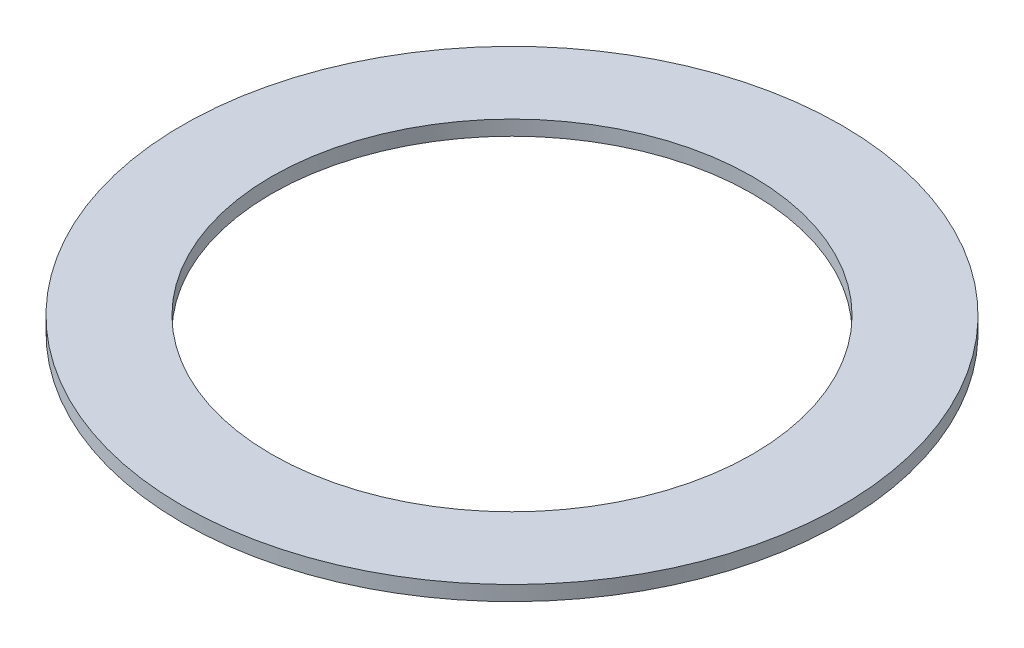
ISO-10303-21;
HEADER;
FILE_DESCRIPTION(('STEP AP214'),'2;1');
FILE_NAME('part.step','',(''),(''),'','','');
FILE_SCHEMA(('AUTOMOTIVE_DESIGN { 1 0 10303 214 1 1 1 1 }'));
ENDSEC;
DATA;
#1=APPLICATION_CONTEXT('core data for automotive mechanical design processes');
#2=APPLICATION_PROTOCOL_DEFINITION('international standard','automotive_design',2000,#1);
#3=PRODUCT_CONTEXT('',#1,'mechanical');
#4=PRODUCT('Part','Part','',(#3));
#5=PRODUCT_RELATED_PRODUCT_CATEGORY('part','',(#4));
#6=PRODUCT_DEFINITION_FORMATION('','',#4);
#7=PRODUCT_DEFINITION_CONTEXT('part definition',#1,'design');
#8=PRODUCT_DEFINITION('design','',#6,#7);
#9=PRODUCT_DEFINITION_SHAPE('','',#8);
#10=(LENGTH_UNIT() NAMED_UNIT(*) SI_UNIT(.MILLI.,.METRE.));
#11=(NAMED_UNIT(*) PLANE_ANGLE_UNIT() SI_UNIT($,.RADIAN.));
#12=(NAMED_UNIT(*) SI_UNIT($,.STERADIAN.) SOLID_ANGLE_UNIT());
#13=UNCERTAINTY_MEASURE_WITH_UNIT(LENGTH_MEASURE(1.E-05),#10,'distance_accuracy_value','');
#14=(GEOMETRIC_REPRESENTATION_CONTEXT(3) GLOBAL_UNCERTAINTY_ASSIGNED_CONTEXT((#13)) GLOBAL_UNIT_ASSIGNED_CONTEXT((#10,
#11,#12)) REPRESENTATION_CONTEXT('',''));
#15=CARTESIAN_POINT('',(0.,0.,0.));
#16=DIRECTION('',(0.,0.,1.));
#17=DIRECTION('',(1.,0.,0.));
#18=AXIS2_PLACEMENT_3D('',#15,#16,#17);
#19=CARTESIAN_POINT('',(0.,0.5,0.));
#20=DIRECTION('',(0.,1.,0.));
#21=DIRECTION('',(0.,0.,1.));
#22=AXIS2_PLACEMENT_3D('',#19,#20,#21);
#23=PLANE('',#22);
#24=CARTESIAN_POINT('',(0.,0.5,0.));
#25=DIRECTION('',(0.,1.,0.));
#26=DIRECTION('',(0.,0.,1.));
#27=AXIS2_PLACEMENT_3D('',#24,#25,#26);
#28=CIRCLE('',#27,11.1);
#29=CARTESIAN_POINT('',(0.,0.5,11.1));
#30=VERTEX_POINT('',#29);
#31=EDGE_CURVE('E10',#30,#30,#28,.T.);
#32=ORIENTED_EDGE('',*,*,#31,.T.);
#33=EDGE_LOOP('',(#32));
#34=FACE_BOUND('',#33,.T.);
#35=CARTESIAN_POINT('',(0.,0.5,0.));
#36=DIRECTION('',(0.,1.,0.));
#37=DIRECTION('',(0.,0.,1.));
#38=AXIS2_PLACEMENT_3D('',#35,#36,#37);
#39=CIRCLE('',#38,8.1);
#40=CARTESIAN_POINT('',(0.,0.5,8.1));
#41=VERTEX_POINT('',#40);
#42=EDGE_CURVE('E41',#41,#41,#39,.T.);
#43=ORIENTED_EDGE('',*,*,#42,.F.);
#44=EDGE_LOOP('',(#43));
#45=FACE_BOUND('',#44,.T.);
#46=ADVANCED_FACE('F30',(#34,#45),#23,.T.);
#47=CARTESIAN_POINT('',(0.,0.,0.));
#48=DIRECTION('',(0.,1.,0.));
#49=DIRECTION('',(0.,0.,1.));
#50=AXIS2_PLACEMENT_3D('',#47,#48,#49);
#51=PLANE('',#50);
#52=CARTESIAN_POINT('',(0.,0.,0.));
#53=DIRECTION('',(0.,1.,0.));
#54=DIRECTION('',(0.,0.,1.));
#55=AXIS2_PLACEMENT_3D('',#52,#53,#54);
#56=CIRCLE('',#55,11.1);
#57=CARTESIAN_POINT('',(0.,0.,11.1));
#58=VERTEX_POINT('',#57);
#59=EDGE_CURVE('E34',#58,#58,#56,.T.);
#60=ORIENTED_EDGE('',*,*,#59,.F.);
#61=EDGE_LOOP('',(#60));
#62=FACE_BOUND('',#61,.T.);
#63=CARTESIAN_POINT('',(0.,0.,0.));
#64=DIRECTION('',(0.,1.,0.));
#65=DIRECTION('',(0.,0.,1.));
#66=AXIS2_PLACEMENT_3D('',#63,#64,#65);
#67=CIRCLE('',#66,8.1);
#68=CARTESIAN_POINT('',(0.,0.,8.1));
#69=VERTEX_POINT('',#68);
#70=EDGE_CURVE('E43',#69,#69,#67,.T.);
#71=ORIENTED_EDGE('',*,*,#70,.T.);
#72=EDGE_LOOP('',(#71));
#73=FACE_BOUND('',#72,.T.);
#74=ADVANCED_FACE('F53',(#62,#73),#51,.F.);
#75=CARTESIAN_POINT('',(0.,0.5,0.));
#76=DIRECTION('',(0.,-1.,0.));
#77=DIRECTION('',(0.,0.,-1.));
#78=AXIS2_PLACEMENT_3D('',#75,#76,#77);
#79=CYLINDRICAL_SURFACE('',#78,11.1);
#80=ORIENTED_EDGE('',*,*,#31,.F.);
#81=EDGE_LOOP('',(#80));
#82=FACE_BOUND('',#81,.T.);
#83=ORIENTED_EDGE('',*,*,#59,.T.);
#84=EDGE_LOOP('',(#83));
#85=FACE_BOUND('',#84,.T.);
#86=ADVANCED_FACE('F32',(#82,#85),#79,.T.);
#87=CARTESIAN_POINT('',(0.,0.5,0.));
#88=DIRECTION('',(0.,-1.,0.));
#89=DIRECTION('',(0.,0.,-1.));
#90=AXIS2_PLACEMENT_3D('',#87,#88,#89);
#91=CYLINDRICAL_SURFACE('',#90,8.1);
#92=ORIENTED_EDGE('',*,*,#42,.T.);
#93=EDGE_LOOP('',(#92));
#94=FACE_BOUND('',#93,.T.);
#95=ORIENTED_EDGE('',*,*,#70,.F.);
#96=EDGE_LOOP('',(#95));
#97=FACE_BOUND('',#96,.T.);
#98=ADVANCED_FACE('F49',(#94,#97),#91,.F.);
#99=CLOSED_SHELL('',(#46,#74,#86,#98));
#100=MANIFOLD_SOLID_BREP('B2',#99);
#101=ADVANCED_BREP_SHAPE_REPRESENTATION('',(#18,#100),#14);
#102=SHAPE_DEFINITION_REPRESENTATION(#9,#101);
ENDSEC;
END-ISO-10303-21;
